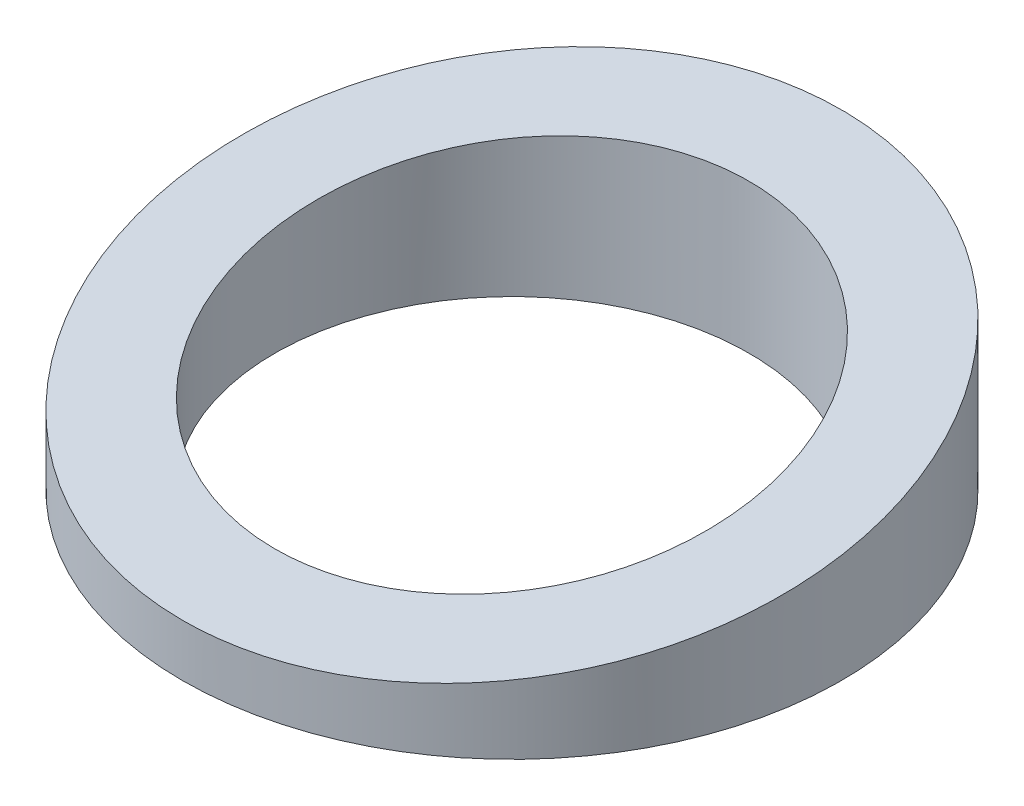
ISO-10303-21;
HEADER;
FILE_DESCRIPTION(('STEP AP214'),'2;1');
FILE_NAME('part.step','',(''),(''),'','','');
FILE_SCHEMA(('AUTOMOTIVE_DESIGN { 1 0 10303 214 1 1 1 1 }'));
ENDSEC;
DATA;
#1=APPLICATION_CONTEXT('core data for automotive mechanical design processes');
#2=APPLICATION_PROTOCOL_DEFINITION('international standard','automotive_design',2000,#1);
#3=PRODUCT_CONTEXT('',#1,'mechanical');
#4=PRODUCT('Part','Part','',(#3));
#5=PRODUCT_RELATED_PRODUCT_CATEGORY('part','',(#4));
#6=PRODUCT_DEFINITION_FORMATION('','',#4);
#7=PRODUCT_DEFINITION_CONTEXT('part definition',#1,'design');
#8=PRODUCT_DEFINITION('design','',#6,#7);
#9=PRODUCT_DEFINITION_SHAPE('','',#8);
#10=(LENGTH_UNIT() NAMED_UNIT(*) SI_UNIT(.MILLI.,.METRE.));
#11=(NAMED_UNIT(*) PLANE_ANGLE_UNIT() SI_UNIT($,.RADIAN.));
#12=(NAMED_UNIT(*) SI_UNIT($,.STERADIAN.) SOLID_ANGLE_UNIT());
#13=UNCERTAINTY_MEASURE_WITH_UNIT(LENGTH_MEASURE(1.E-05),#10,'distance_accuracy_value','');
#14=(GEOMETRIC_REPRESENTATION_CONTEXT(3) GLOBAL_UNCERTAINTY_ASSIGNED_CONTEXT((#13)) GLOBAL_UNIT_ASSIGNED_CONTEXT((#10,
#11,#12)) REPRESENTATION_CONTEXT('',''));
#15=CARTESIAN_POINT('',(0.,0.,0.));
#16=DIRECTION('',(0.,0.,1.));
#17=DIRECTION('',(1.,0.,0.));
#18=AXIS2_PLACEMENT_3D('',#15,#16,#17);
#19=CARTESIAN_POINT('',(0.,1.5875,0.));
#20=DIRECTION('',(0.,-1.,0.));
#21=DIRECTION('',(0.,0.,-1.));
#22=AXIS2_PLACEMENT_3D('',#19,#20,#21);
#23=CYLINDRICAL_SURFACE('',#22,3.175);
#24=CARTESIAN_POINT('',(0.,0.,0.));
#25=DIRECTION('',(0.,1.,0.));
#26=DIRECTION('',(0.,0.,1.));
#27=AXIS2_PLACEMENT_3D('',#24,#25,#26);
#28=CIRCLE('',#27,3.175);
#29=CARTESIAN_POINT('',(0.,0.,3.175));
#30=VERTEX_POINT('',#29);
#31=EDGE_CURVE('E10',#30,#30,#28,.T.);
#32=ORIENTED_EDGE('',*,*,#31,.T.);
#33=EDGE_LOOP('',(#32));
#34=FACE_BOUND('',#33,.T.);
#35=CARTESIAN_POINT('',(0.,1.04535762717479,0.));
#36=DIRECTION('',(0.,-0.985732861019863,-0.168317339289794));
#37=DIRECTION('',(0.,-0.168317339289794,0.985732861019863));
#38=AXIS2_PLACEMENT_3D('',#35,#36,#37);
#39=ELLIPSE('',#38,3.22095379544826,3.175);
#40=CARTESIAN_POINT('',(0.,0.503215254349574,3.175));
#41=VERTEX_POINT('',#40);
#42=EDGE_CURVE('E51',#41,#41,#39,.T.);
#43=ORIENTED_EDGE('',*,*,#42,.T.);
#44=EDGE_LOOP('',(#43));
#45=FACE_BOUND('',#44,.T.);
#46=ADVANCED_FACE('F43',(#34,#45),#23,.T.);
#47=CARTESIAN_POINT('',(0.,0.,0.));
#48=DIRECTION('',(0.,1.,0.));
#49=DIRECTION('',(0.,0.,1.));
#50=AXIS2_PLACEMENT_3D('',#47,#48,#49);
#51=PLANE('',#50);
#52=CARTESIAN_POINT('',(0.,0.,0.));
#53=DIRECTION('',(0.,1.,0.));
#54=DIRECTION('',(0.,0.,1.));
#55=AXIS2_PLACEMENT_3D('',#52,#53,#54);
#56=CIRCLE('',#55,2.286);
#57=CARTESIAN_POINT('',(0.,0.,2.286));
#58=VERTEX_POINT('',#57);
#59=EDGE_CURVE('E56',#58,#58,#56,.T.);
#60=ORIENTED_EDGE('',*,*,#59,.T.);
#61=EDGE_LOOP('',(#60));
#62=FACE_BOUND('',#61,.T.);
#63=ORIENTED_EDGE('',*,*,#31,.F.);
#64=EDGE_LOOP('',(#63));
#65=FACE_BOUND('',#64,.T.);
#66=ADVANCED_FACE('F77',(#62,#65),#51,.F.);
#67=CARTESIAN_POINT('',(-3.175,1.5875,-3.175));
#68=DIRECTION('',(0.,-0.985732861019863,-0.168317339289794));
#69=DIRECTION('',(0.,0.168317339289794,-0.985732861019863));
#70=AXIS2_PLACEMENT_3D('',#67,#68,#69);
#71=PLANE('',#70);
#72=CARTESIAN_POINT('',(0.,1.04535762717479,0.));
#73=DIRECTION('',(0.,-0.985732861019863,-0.168317339289794));
#74=DIRECTION('',(0.,-0.168317339289794,0.985732861019863));
#75=AXIS2_PLACEMENT_3D('',#72,#73,#74);
#76=ELLIPSE('',#75,2.31908673272275,2.286);
#77=CARTESIAN_POINT('',(0.,0.655015118740633,2.286));
#78=VERTEX_POINT('',#77);
#79=EDGE_CURVE('E46',#78,#78,#76,.T.);
#80=ORIENTED_EDGE('',*,*,#79,.T.);
#81=EDGE_LOOP('',(#80));
#82=FACE_BOUND('',#81,.T.);
#83=ORIENTED_EDGE('',*,*,#42,.F.);
#84=EDGE_LOOP('',(#83));
#85=FACE_BOUND('',#84,.T.);
#86=ADVANCED_FACE('F67',(#82,#85),#71,.F.);
#87=CARTESIAN_POINT('',(0.,1.5875,0.));
#88=DIRECTION('',(0.,-1.,0.));
#89=DIRECTION('',(0.,0.,-1.));
#90=AXIS2_PLACEMENT_3D('',#87,#88,#89);
#91=CYLINDRICAL_SURFACE('',#90,2.286);
#92=ORIENTED_EDGE('',*,*,#79,.F.);
#93=EDGE_LOOP('',(#92));
#94=FACE_BOUND('',#93,.T.);
#95=ORIENTED_EDGE('',*,*,#59,.F.);
#96=EDGE_LOOP('',(#95));
#97=FACE_BOUND('',#96,.T.);
#98=ADVANCED_FACE('F70',(#94,#97),#91,.F.);
#99=CLOSED_SHELL('',(#46,#66,#86,#98));
#100=MANIFOLD_SOLID_BREP('B2',#99);
#101=ADVANCED_BREP_SHAPE_REPRESENTATION('',(#18,#100),#14);
#102=SHAPE_DEFINITION_REPRESENTATION(#9,#101);
ENDSEC;
END-ISO-10303-21;
